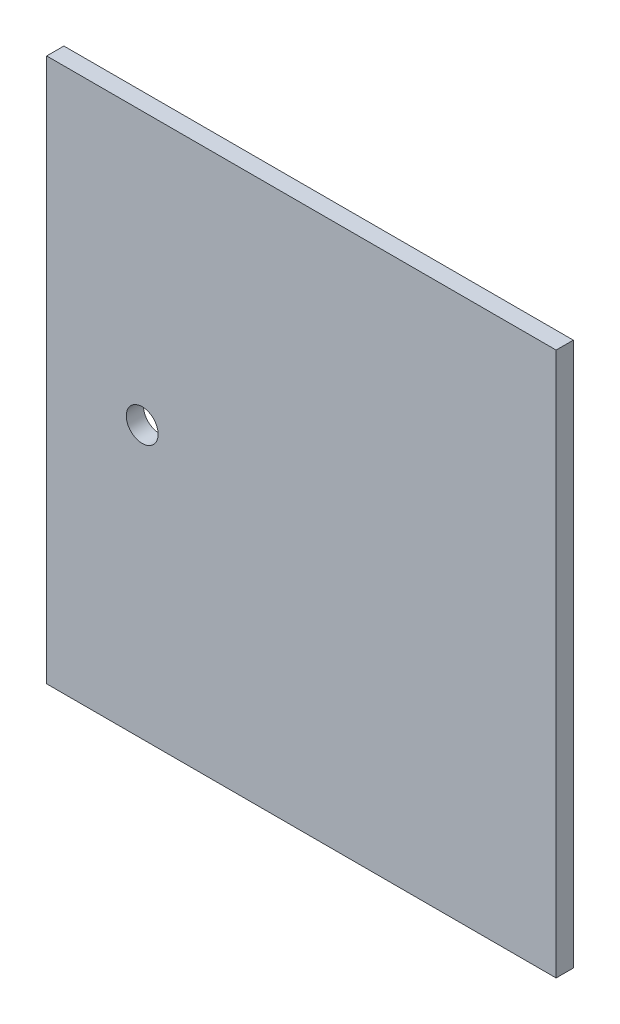
ISO-10303-21;
HEADER;
FILE_DESCRIPTION(('STEP AP214'),'2;1');
FILE_NAME('part.step','',(''),(''),'','','');
FILE_SCHEMA(('AUTOMOTIVE_DESIGN { 1 0 10303 214 1 1 1 1 }'));
ENDSEC;
DATA;
#1=APPLICATION_CONTEXT('core data for automotive mechanical design processes');
#2=APPLICATION_PROTOCOL_DEFINITION('international standard','automotive_design',2000,#1);
#3=PRODUCT_CONTEXT('',#1,'mechanical');
#4=PRODUCT('Part','Part','',(#3));
#5=PRODUCT_RELATED_PRODUCT_CATEGORY('part','',(#4));
#6=PRODUCT_DEFINITION_FORMATION('','',#4);
#7=PRODUCT_DEFINITION_CONTEXT('part definition',#1,'design');
#8=PRODUCT_DEFINITION('design','',#6,#7);
#9=PRODUCT_DEFINITION_SHAPE('','',#8);
#10=(LENGTH_UNIT() NAMED_UNIT(*) SI_UNIT(.MILLI.,.METRE.));
#11=(NAMED_UNIT(*) PLANE_ANGLE_UNIT() SI_UNIT($,.RADIAN.));
#12=(NAMED_UNIT(*) SI_UNIT($,.STERADIAN.) SOLID_ANGLE_UNIT());
#13=UNCERTAINTY_MEASURE_WITH_UNIT(LENGTH_MEASURE(1.E-05),#10,'distance_accuracy_value','');
#14=(GEOMETRIC_REPRESENTATION_CONTEXT(3) GLOBAL_UNCERTAINTY_ASSIGNED_CONTEXT((#13)) GLOBAL_UNIT_ASSIGNED_CONTEXT((#10,
#11,#12)) REPRESENTATION_CONTEXT('',''));
#15=CARTESIAN_POINT('',(0.,0.,0.));
#16=DIRECTION('',(0.,0.,1.));
#17=DIRECTION('',(1.,0.,0.));
#18=AXIS2_PLACEMENT_3D('',#15,#16,#17);
#19=CARTESIAN_POINT('',(-82.7,0.,2.7));
#20=DIRECTION('',(1.,0.,0.));
#21=DIRECTION('',(0.,0.,-1.));
#22=AXIS2_PLACEMENT_3D('',#19,#20,#21);
#23=PLANE('',#22);
#24=DIRECTION('',(0.,-1.,0.));
#25=VECTOR('',#24,1.);
#26=CARTESIAN_POINT('',(-82.7,0.,0.));
#27=LINE('',#26,#25);
#28=CARTESIAN_POINT('',(-82.7,85.4,0.));
#29=VERTEX_POINT('',#28);
#30=CARTESIAN_POINT('',(-82.7,0.,0.));
#31=VERTEX_POINT('',#30);
#32=EDGE_CURVE('E96',#29,#31,#27,.T.);
#33=ORIENTED_EDGE('',*,*,#32,.T.);
#34=DIRECTION('',(0.,0.,-1.));
#35=VECTOR('',#34,1.);
#36=CARTESIAN_POINT('',(-82.7,0.,2.7));
#37=LINE('',#36,#35);
#38=CARTESIAN_POINT('',(-82.7,0.,2.7));
#39=VERTEX_POINT('',#38);
#40=EDGE_CURVE('E11',#39,#31,#37,.T.);
#41=ORIENTED_EDGE('',*,*,#40,.F.);
#42=DIRECTION('',(0.,-1.,0.));
#43=VECTOR('',#42,1.);
#44=CARTESIAN_POINT('',(-82.7,0.,2.7));
#45=LINE('',#44,#43);
#46=CARTESIAN_POINT('',(-82.7,85.4,2.7));
#47=VERTEX_POINT('',#46);
#48=EDGE_CURVE('E84',#47,#39,#45,.T.);
#49=ORIENTED_EDGE('',*,*,#48,.F.);
#50=DIRECTION('',(0.,0.,-1.));
#51=VECTOR('',#50,1.);
#52=CARTESIAN_POINT('',(-82.7,85.4,2.7));
#53=LINE('',#52,#51);
#54=EDGE_CURVE('E92',#47,#29,#53,.T.);
#55=ORIENTED_EDGE('',*,*,#54,.T.);
#56=EDGE_LOOP('',(#33,#41,#49,#55));
#57=FACE_BOUND('',#56,.T.);
#58=ADVANCED_FACE('F33',(#57),#23,.F.);
#59=CARTESIAN_POINT('',(-82.7,0.,2.7));
#60=DIRECTION('',(0.,1.,0.));
#61=DIRECTION('',(0.,0.,1.));
#62=AXIS2_PLACEMENT_3D('',#59,#60,#61);
#63=PLANE('',#62);
#64=DIRECTION('',(1.,0.,0.));
#65=VECTOR('',#64,1.);
#66=CARTESIAN_POINT('',(-82.7,0.,0.));
#67=LINE('',#66,#65);
#68=CARTESIAN_POINT('',(-2.70000000000001,0.,0.));
#69=VERTEX_POINT('',#68);
#70=EDGE_CURVE('E88',#31,#69,#67,.T.);
#71=ORIENTED_EDGE('',*,*,#70,.T.);
#72=DIRECTION('',(0.,0.,-1.));
#73=VECTOR('',#72,1.);
#74=CARTESIAN_POINT('',(-2.70000000000001,0.,2.7));
#75=LINE('',#74,#73);
#76=CARTESIAN_POINT('',(-2.70000000000001,0.,2.7));
#77=VERTEX_POINT('',#76);
#78=EDGE_CURVE('E41',#77,#69,#75,.T.);
#79=ORIENTED_EDGE('',*,*,#78,.F.);
#80=DIRECTION('',(1.,0.,0.));
#81=VECTOR('',#80,1.);
#82=CARTESIAN_POINT('',(-82.7,0.,2.7));
#83=LINE('',#82,#81);
#84=EDGE_CURVE('E79',#39,#77,#83,.T.);
#85=ORIENTED_EDGE('',*,*,#84,.F.);
#86=ORIENTED_EDGE('',*,*,#40,.T.);
#87=EDGE_LOOP('',(#71,#79,#85,#86));
#88=FACE_BOUND('',#87,.T.);
#89=ADVANCED_FACE('F87',(#88),#63,.F.);
#90=CARTESIAN_POINT('',(-2.70000000000001,0.,2.7));
#91=DIRECTION('',(-1.,0.,0.));
#92=DIRECTION('',(0.,0.,1.));
#93=AXIS2_PLACEMENT_3D('',#90,#91,#92);
#94=PLANE('',#93);
#95=DIRECTION('',(0.,1.,0.));
#96=VECTOR('',#95,1.);
#97=CARTESIAN_POINT('',(-2.70000000000001,0.,0.));
#98=LINE('',#97,#96);
#99=CARTESIAN_POINT('',(-2.70000000000001,85.4,0.));
#100=VERTEX_POINT('',#99);
#101=EDGE_CURVE('E66',#69,#100,#98,.T.);
#102=ORIENTED_EDGE('',*,*,#101,.T.);
#103=DIRECTION('',(0.,0.,-1.));
#104=VECTOR('',#103,1.);
#105=CARTESIAN_POINT('',(-2.70000000000001,85.4,2.7));
#106=LINE('',#105,#104);
#107=CARTESIAN_POINT('',(-2.70000000000001,85.4,2.7));
#108=VERTEX_POINT('',#107);
#109=EDGE_CURVE('E89',#108,#100,#106,.T.);
#110=ORIENTED_EDGE('',*,*,#109,.F.);
#111=DIRECTION('',(0.,1.,0.));
#112=VECTOR('',#111,1.);
#113=CARTESIAN_POINT('',(-2.70000000000001,0.,2.7));
#114=LINE('',#113,#112);
#115=EDGE_CURVE('E82',#77,#108,#114,.T.);
#116=ORIENTED_EDGE('',*,*,#115,.F.);
#117=ORIENTED_EDGE('',*,*,#78,.T.);
#118=EDGE_LOOP('',(#102,#110,#116,#117));
#119=FACE_BOUND('',#118,.T.);
#120=ADVANCED_FACE('F90',(#119),#94,.F.);
#121=CARTESIAN_POINT('',(-82.7,85.4,2.7));
#122=DIRECTION('',(0.,-1.,0.));
#123=DIRECTION('',(0.,0.,-1.));
#124=AXIS2_PLACEMENT_3D('',#121,#122,#123);
#125=PLANE('',#124);
#126=DIRECTION('',(-1.,0.,0.));
#127=VECTOR('',#126,1.);
#128=CARTESIAN_POINT('',(-82.7,85.4,0.));
#129=LINE('',#128,#127);
#130=EDGE_CURVE('E72',#100,#29,#129,.T.);
#131=ORIENTED_EDGE('',*,*,#130,.T.);
#132=ORIENTED_EDGE('',*,*,#54,.F.);
#133=DIRECTION('',(-1.,0.,0.));
#134=VECTOR('',#133,1.);
#135=CARTESIAN_POINT('',(-82.7,85.4,2.7));
#136=LINE('',#135,#134);
#137=EDGE_CURVE('E49',#108,#47,#136,.T.);
#138=ORIENTED_EDGE('',*,*,#137,.F.);
#139=ORIENTED_EDGE('',*,*,#109,.T.);
#140=EDGE_LOOP('',(#131,#132,#138,#139));
#141=FACE_BOUND('',#140,.T.);
#142=ADVANCED_FACE('F104',(#141),#125,.F.);
#143=CARTESIAN_POINT('',(0.,0.,2.7));
#144=DIRECTION('',(0.,0.,-1.));
#145=DIRECTION('',(-1.,0.,0.));
#146=AXIS2_PLACEMENT_3D('',#143,#144,#145);
#147=PLANE('',#146);
#148=CARTESIAN_POINT('',(-67.7,42.7,2.7));
#149=DIRECTION('',(0.,0.,1.));
#150=DIRECTION('',(1.,0.,0.));
#151=AXIS2_PLACEMENT_3D('',#148,#149,#150);
#152=CIRCLE('',#151,2.5);
#153=CARTESIAN_POINT('',(-65.2,42.7,2.7));
#154=VERTEX_POINT('',#153);
#155=EDGE_CURVE('E110',#154,#154,#152,.T.);
#156=ORIENTED_EDGE('',*,*,#155,.F.);
#157=EDGE_LOOP('',(#156));
#158=FACE_BOUND('',#157,.T.);
#159=ORIENTED_EDGE('',*,*,#48,.T.);
#160=ORIENTED_EDGE('',*,*,#84,.T.);
#161=ORIENTED_EDGE('',*,*,#115,.T.);
#162=ORIENTED_EDGE('',*,*,#137,.T.);
#163=EDGE_LOOP('',(#159,#160,#161,#162));
#164=FACE_BOUND('',#163,.T.);
#165=ADVANCED_FACE('F80',(#158,#164),#147,.F.);
#166=CARTESIAN_POINT('',(0.,0.,0.));
#167=DIRECTION('',(0.,0.,-1.));
#168=DIRECTION('',(-1.,0.,0.));
#169=AXIS2_PLACEMENT_3D('',#166,#167,#168);
#170=PLANE('',#169);
#171=CARTESIAN_POINT('',(-67.7,42.7,0.));
#172=DIRECTION('',(0.,0.,1.));
#173=DIRECTION('',(1.,0.,0.));
#174=AXIS2_PLACEMENT_3D('',#171,#172,#173);
#175=CIRCLE('',#174,2.5);
#176=CARTESIAN_POINT('',(-65.2,42.7,0.));
#177=VERTEX_POINT('',#176);
#178=EDGE_CURVE('E99',#177,#177,#175,.T.);
#179=ORIENTED_EDGE('',*,*,#178,.T.);
#180=EDGE_LOOP('',(#179));
#181=FACE_BOUND('',#180,.T.);
#182=ORIENTED_EDGE('',*,*,#32,.F.);
#183=ORIENTED_EDGE('',*,*,#130,.F.);
#184=ORIENTED_EDGE('',*,*,#101,.F.);
#185=ORIENTED_EDGE('',*,*,#70,.F.);
#186=EDGE_LOOP('',(#182,#183,#184,#185));
#187=FACE_BOUND('',#186,.T.);
#188=ADVANCED_FACE('F107',(#181,#187),#170,.T.);
#189=CARTESIAN_POINT('',(-67.7,42.7,0.));
#190=DIRECTION('',(0.,0.,1.));
#191=DIRECTION('',(1.,0.,0.));
#192=AXIS2_PLACEMENT_3D('',#189,#190,#191);
#193=CYLINDRICAL_SURFACE('',#192,2.5);
#194=CARTESIAN_POINT('',(-65.2,42.7,0.));
#195=CARTESIAN_POINT('',(-65.2,42.7,0.028125));
#196=CARTESIAN_POINT('',(-65.2,42.7,0.05625));
#197=CARTESIAN_POINT('',(-65.2,42.7,0.1125));
#198=CARTESIAN_POINT('',(-65.2,42.7,0.140625));
#199=CARTESIAN_POINT('',(-65.2,42.7,0.196875));
#200=CARTESIAN_POINT('',(-65.2,42.7,0.225));
#201=CARTESIAN_POINT('',(-65.2,42.7,0.28125));
#202=CARTESIAN_POINT('',(-65.2,42.7,0.309375));
#203=CARTESIAN_POINT('',(-65.2,42.7,0.365625));
#204=CARTESIAN_POINT('',(-65.2,42.7,0.39375));
#205=CARTESIAN_POINT('',(-65.2,42.7,0.45));
#206=CARTESIAN_POINT('',(-65.2,42.7,0.478125));
#207=CARTESIAN_POINT('',(-65.2,42.7,0.534375));
#208=CARTESIAN_POINT('',(-65.2,42.7,0.5625));
#209=CARTESIAN_POINT('',(-65.2,42.7,0.61875));
#210=CARTESIAN_POINT('',(-65.2,42.7,0.646875));
#211=CARTESIAN_POINT('',(-65.2,42.7,0.703125));
#212=CARTESIAN_POINT('',(-65.2,42.7,0.73125));
#213=CARTESIAN_POINT('',(-65.2,42.7,0.7875));
#214=CARTESIAN_POINT('',(-65.2,42.7,0.815625));
#215=CARTESIAN_POINT('',(-65.2,42.7,0.871875));
#216=CARTESIAN_POINT('',(-65.2,42.7,0.9));
#217=CARTESIAN_POINT('',(-65.2,42.7,0.95625));
#218=CARTESIAN_POINT('',(-65.2,42.7,0.984375));
#219=CARTESIAN_POINT('',(-65.2,42.7,1.040625));
#220=CARTESIAN_POINT('',(-65.2,42.7,1.06875));
#221=CARTESIAN_POINT('',(-65.2,42.7,1.125));
#222=CARTESIAN_POINT('',(-65.2,42.7,1.153125));
#223=CARTESIAN_POINT('',(-65.2,42.7,1.209375));
#224=CARTESIAN_POINT('',(-65.2,42.7,1.2375));
#225=CARTESIAN_POINT('',(-65.2,42.7,1.29375));
#226=CARTESIAN_POINT('',(-65.2,42.7,1.321875));
#227=CARTESIAN_POINT('',(-65.2,42.7,1.378125));
#228=CARTESIAN_POINT('',(-65.2,42.7,1.40625));
#229=CARTESIAN_POINT('',(-65.2,42.7,1.4625));
#230=CARTESIAN_POINT('',(-65.2,42.7,1.490625));
#231=CARTESIAN_POINT('',(-65.2,42.7,1.546875));
#232=CARTESIAN_POINT('',(-65.2,42.7,1.575));
#233=CARTESIAN_POINT('',(-65.2,42.7,1.63125));
#234=CARTESIAN_POINT('',(-65.2,42.7,1.659375));
#235=CARTESIAN_POINT('',(-65.2,42.7,1.715625));
#236=CARTESIAN_POINT('',(-65.2,42.7,1.74375));
#237=CARTESIAN_POINT('',(-65.2,42.7,1.8));
#238=CARTESIAN_POINT('',(-65.2,42.7,1.828125));
#239=CARTESIAN_POINT('',(-65.2,42.7,1.884375));
#240=CARTESIAN_POINT('',(-65.2,42.7,1.9125));
#241=CARTESIAN_POINT('',(-65.2,42.7,1.96875));
#242=CARTESIAN_POINT('',(-65.2,42.7,1.996875));
#243=CARTESIAN_POINT('',(-65.2,42.7,2.053125));
#244=CARTESIAN_POINT('',(-65.2,42.7,2.08125));
#245=CARTESIAN_POINT('',(-65.2,42.7,2.1375));
#246=CARTESIAN_POINT('',(-65.2,42.7,2.165625));
#247=CARTESIAN_POINT('',(-65.2,42.7,2.221875));
#248=CARTESIAN_POINT('',(-65.2,42.7,2.25));
#249=CARTESIAN_POINT('',(-65.2,42.7,2.30625));
#250=CARTESIAN_POINT('',(-65.2,42.7,2.334375));
#251=CARTESIAN_POINT('',(-65.2,42.7,2.390625));
#252=CARTESIAN_POINT('',(-65.2,42.7,2.41875));
#253=CARTESIAN_POINT('',(-65.2,42.7,2.475));
#254=CARTESIAN_POINT('',(-65.2,42.7,2.503125));
#255=CARTESIAN_POINT('',(-65.2,42.7,2.559375));
#256=CARTESIAN_POINT('',(-65.2,42.7,2.5875));
#257=CARTESIAN_POINT('',(-65.2,42.7,2.64375));
#258=CARTESIAN_POINT('',(-65.2,42.7,2.671875));
#259=CARTESIAN_POINT('',(-65.2,42.7,2.7));
#260=B_SPLINE_CURVE_WITH_KNOTS('',3,(#194,#195,#196,#197,#198,#199,#200,#201,#202,#203,#204,
#205,#206,#207,#208,#209,#210,#211,#212,#213,#214,#215,#216,#217,#218,#219,#220,#221,#222,#223,
#224,#225,#226,#227,#228,#229,#230,#231,#232,#233,#234,#235,#236,#237,#238,#239,#240,#241,#242,
#243,#244,#245,#246,#247,#248,#249,#250,#251,#252,#253,#254,#255,#256,#257,#258,#259),
.UNSPECIFIED.,.F.,.F.,(4,2,2,2,2,2,2,2,2,2,2,2,2,2,2,2,2,2,2,2,2,2,2,2,2,2,2,2,2,2,2,2,4),(0.,
0.084375,0.16875,0.253125,0.3375,0.421875,0.50625,0.590625,0.675,0.759375,0.84375,0.928125,
1.0125,1.096875,1.18125,1.265625,1.35,1.434375,1.51875,1.603125,1.6875,1.771875,1.85625,
1.940625,2.025,2.109375,2.19375,2.278125,2.3625,2.446875,2.53125,2.615625,2.7),.UNSPECIFIED.);
#261=EDGE_CURVE('BSEAM117',#177,#154,#260,.T.);
#262=ORIENTED_EDGE('',*,*,#178,.F.);
#263=ORIENTED_EDGE('',*,*,#155,.T.);
#264=ORIENTED_EDGE('',*,*,#261,.T.);
#265=ORIENTED_EDGE('',*,*,#261,.F.);
#266=EDGE_LOOP('',(#262,#264,#263,#265));
#267=FACE_BOUND('',#266,.T.);
#268=ADVANCED_FACE('F117',(#267),#193,.F.);
#269=CLOSED_SHELL('',(#58,#89,#120,#142,#165,#188,#268));
#270=MANIFOLD_SOLID_BREP('B2',#269);
#271=ADVANCED_BREP_SHAPE_REPRESENTATION('',(#18,#270),#14);
#272=SHAPE_DEFINITION_REPRESENTATION(#9,#271);
ENDSEC;
END-ISO-10303-21;
